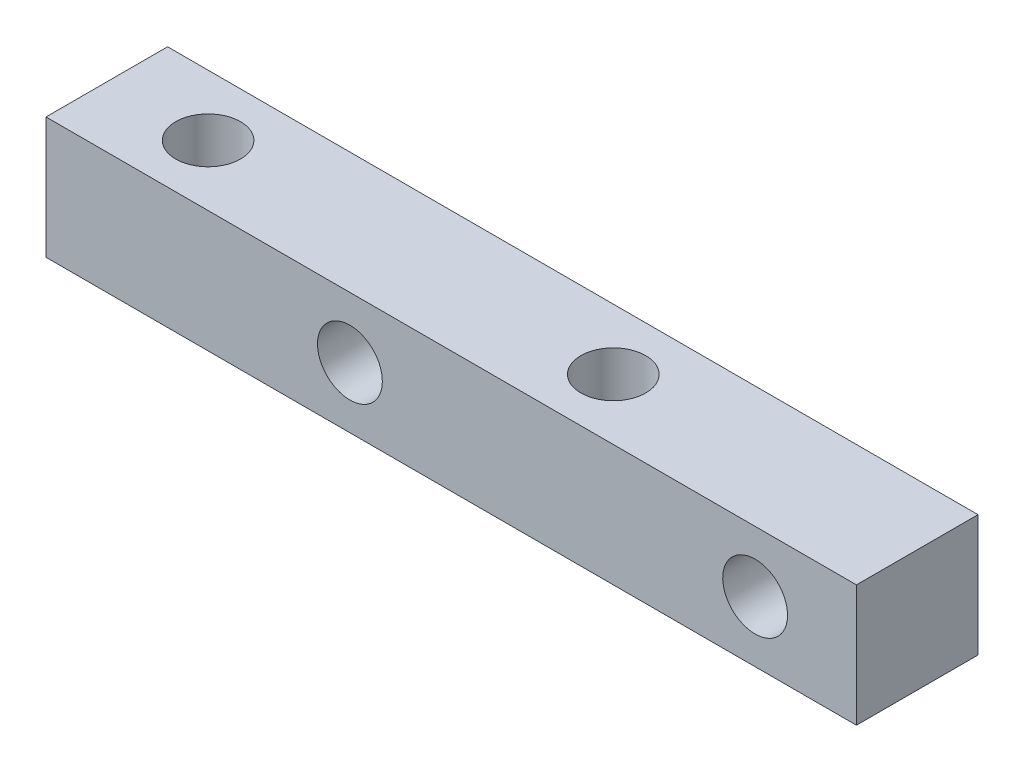
ISO-10303-21;
HEADER;
FILE_DESCRIPTION(('STEP AP214'),'2;1');
FILE_NAME('part.step','',(''),(''),'','','');
FILE_SCHEMA(('AUTOMOTIVE_DESIGN { 1 0 10303 214 1 1 1 1 }'));
ENDSEC;
DATA;
#1=APPLICATION_CONTEXT('core data for automotive mechanical design processes');
#2=APPLICATION_PROTOCOL_DEFINITION('international standard','automotive_design',2000,#1);
#3=PRODUCT_CONTEXT('',#1,'mechanical');
#4=PRODUCT('Part','Part','',(#3));
#5=PRODUCT_RELATED_PRODUCT_CATEGORY('part','',(#4));
#6=PRODUCT_DEFINITION_FORMATION('','',#4);
#7=PRODUCT_DEFINITION_CONTEXT('part definition',#1,'design');
#8=PRODUCT_DEFINITION('design','',#6,#7);
#9=PRODUCT_DEFINITION_SHAPE('','',#8);
#10=(LENGTH_UNIT() NAMED_UNIT(*) SI_UNIT(.MILLI.,.METRE.));
#11=(NAMED_UNIT(*) PLANE_ANGLE_UNIT() SI_UNIT($,.RADIAN.));
#12=(NAMED_UNIT(*) SI_UNIT($,.STERADIAN.) SOLID_ANGLE_UNIT());
#13=UNCERTAINTY_MEASURE_WITH_UNIT(LENGTH_MEASURE(1.E-05),#10,'distance_accuracy_value','');
#14=(GEOMETRIC_REPRESENTATION_CONTEXT(3) GLOBAL_UNCERTAINTY_ASSIGNED_CONTEXT((#13)) GLOBAL_UNIT_ASSIGNED_CONTEXT((#10,
#11,#12)) REPRESENTATION_CONTEXT('',''));
#15=CARTESIAN_POINT('',(0.,0.,0.));
#16=DIRECTION('',(0.,0.,1.));
#17=DIRECTION('',(1.,0.,0.));
#18=AXIS2_PLACEMENT_3D('',#15,#16,#17);
#19=CARTESIAN_POINT('',(40.,3.,-3.));
#20=DIRECTION('',(0.,0.,1.));
#21=DIRECTION('',(0.,-1.,0.));
#22=AXIS2_PLACEMENT_3D('',#19,#20,#21);
#23=PLANE('',#22);
#24=CARTESIAN_POINT('',(35.,0.,-3.));
#25=DIRECTION('',(0.,0.,-1.));
#26=DIRECTION('',(0.,1.,0.));
#27=AXIS2_PLACEMENT_3D('',#24,#25,#26);
#28=CIRCLE('',#27,1.6);
#29=CARTESIAN_POINT('',(35.,1.6,-3.));
#30=VERTEX_POINT('',#29);
#31=EDGE_CURVE('E123',#30,#30,#28,.T.);
#32=ORIENTED_EDGE('',*,*,#31,.F.);
#33=EDGE_LOOP('',(#32));
#34=FACE_BOUND('',#33,.T.);
#35=CARTESIAN_POINT('',(15.,0.,-3.));
#36=DIRECTION('',(0.,0.,-1.));
#37=DIRECTION('',(0.,1.,0.));
#38=AXIS2_PLACEMENT_3D('',#35,#36,#37);
#39=CIRCLE('',#38,1.6);
#40=CARTESIAN_POINT('',(15.,1.6,-3.));
#41=VERTEX_POINT('',#40);
#42=EDGE_CURVE('E119',#41,#41,#39,.T.);
#43=ORIENTED_EDGE('',*,*,#42,.F.);
#44=EDGE_LOOP('',(#43));
#45=FACE_BOUND('',#44,.T.);
#46=DIRECTION('',(0.,1.,0.));
#47=VECTOR('',#46,1.);
#48=CARTESIAN_POINT('',(0.,3.,-3.));
#49=LINE('',#48,#47);
#50=CARTESIAN_POINT('',(0.,-3.,-3.));
#51=VERTEX_POINT('',#50);
#52=CARTESIAN_POINT('',(0.,3.,-3.));
#53=VERTEX_POINT('',#52);
#54=EDGE_CURVE('E102',#51,#53,#49,.T.);
#55=ORIENTED_EDGE('',*,*,#54,.T.);
#56=DIRECTION('',(-1.,0.,0.));
#57=VECTOR('',#56,1.);
#58=CARTESIAN_POINT('',(40.,3.,-3.));
#59=LINE('',#58,#57);
#60=CARTESIAN_POINT('',(40.,3.,-3.));
#61=VERTEX_POINT('',#60);
#62=EDGE_CURVE('E11',#61,#53,#59,.T.);
#63=ORIENTED_EDGE('',*,*,#62,.F.);
#64=DIRECTION('',(0.,1.,0.));
#65=VECTOR('',#64,1.);
#66=CARTESIAN_POINT('',(40.,3.,-3.));
#67=LINE('',#66,#65);
#68=CARTESIAN_POINT('',(40.,-3.,-3.));
#69=VERTEX_POINT('',#68);
#70=EDGE_CURVE('E90',#69,#61,#67,.T.);
#71=ORIENTED_EDGE('',*,*,#70,.F.);
#72=DIRECTION('',(-1.,0.,0.));
#73=VECTOR('',#72,1.);
#74=CARTESIAN_POINT('',(40.,-3.,-3.));
#75=LINE('',#74,#73);
#76=EDGE_CURVE('E98',#69,#51,#75,.T.);
#77=ORIENTED_EDGE('',*,*,#76,.T.);
#78=EDGE_LOOP('',(#55,#63,#71,#77));
#79=FACE_BOUND('',#78,.T.);
#80=ADVANCED_FACE('F39',(#34,#45,#79),#23,.F.);
#81=CARTESIAN_POINT('',(40.,3.,3.));
#82=DIRECTION('',(0.,-1.,0.));
#83=DIRECTION('',(0.,0.,-1.));
#84=AXIS2_PLACEMENT_3D('',#81,#82,#83);
#85=PLANE('',#84);
#86=CARTESIAN_POINT('',(5.,3.,0.));
#87=DIRECTION('',(0.,1.,0.));
#88=DIRECTION('',(0.,0.,1.));
#89=AXIS2_PLACEMENT_3D('',#86,#87,#88);
#90=CIRCLE('',#89,1.6);
#91=CARTESIAN_POINT('',(5.,3.,1.6));
#92=VERTEX_POINT('',#91);
#93=EDGE_CURVE('E134',#92,#92,#90,.T.);
#94=ORIENTED_EDGE('',*,*,#93,.F.);
#95=EDGE_LOOP('',(#94));
#96=FACE_BOUND('',#95,.T.);
#97=CARTESIAN_POINT('',(25.,3.,0.));
#98=DIRECTION('',(0.,1.,0.));
#99=DIRECTION('',(0.,0.,1.));
#100=AXIS2_PLACEMENT_3D('',#97,#98,#99);
#101=CIRCLE('',#100,1.6);
#102=CARTESIAN_POINT('',(25.,3.,1.6));
#103=VERTEX_POINT('',#102);
#104=EDGE_CURVE('E131',#103,#103,#101,.T.);
#105=ORIENTED_EDGE('',*,*,#104,.F.);
#106=EDGE_LOOP('',(#105));
#107=FACE_BOUND('',#106,.T.);
#108=DIRECTION('',(0.,0.,1.));
#109=VECTOR('',#108,1.);
#110=CARTESIAN_POINT('',(0.,3.,3.));
#111=LINE('',#110,#109);
#112=CARTESIAN_POINT('',(0.,3.,3.));
#113=VERTEX_POINT('',#112);
#114=EDGE_CURVE('E94',#53,#113,#111,.T.);
#115=ORIENTED_EDGE('',*,*,#114,.T.);
#116=DIRECTION('',(-1.,0.,0.));
#117=VECTOR('',#116,1.);
#118=CARTESIAN_POINT('',(40.,3.,3.));
#119=LINE('',#118,#117);
#120=CARTESIAN_POINT('',(40.,3.,3.));
#121=VERTEX_POINT('',#120);
#122=EDGE_CURVE('E47',#121,#113,#119,.T.);
#123=ORIENTED_EDGE('',*,*,#122,.F.);
#124=DIRECTION('',(0.,0.,1.));
#125=VECTOR('',#124,1.);
#126=CARTESIAN_POINT('',(40.,3.,3.));
#127=LINE('',#126,#125);
#128=EDGE_CURVE('E85',#61,#121,#127,.T.);
#129=ORIENTED_EDGE('',*,*,#128,.F.);
#130=ORIENTED_EDGE('',*,*,#62,.T.);
#131=EDGE_LOOP('',(#115,#123,#129,#130));
#132=FACE_BOUND('',#131,.T.);
#133=ADVANCED_FACE('F93',(#96,#107,#132),#85,.F.);
#134=CARTESIAN_POINT('',(40.,3.,3.));
#135=DIRECTION('',(0.,0.,-1.));
#136=DIRECTION('',(0.,1.,0.));
#137=AXIS2_PLACEMENT_3D('',#134,#135,#136);
#138=PLANE('',#137);
#139=CARTESIAN_POINT('',(35.,0.,3.));
#140=DIRECTION('',(0.,0.,-1.));
#141=DIRECTION('',(0.,1.,0.));
#142=AXIS2_PLACEMENT_3D('',#139,#140,#141);
#143=CIRCLE('',#142,1.6);
#144=CARTESIAN_POINT('',(35.,1.6,3.));
#145=VERTEX_POINT('',#144);
#146=EDGE_CURVE('E105',#145,#145,#143,.T.);
#147=ORIENTED_EDGE('',*,*,#146,.T.);
#148=EDGE_LOOP('',(#147));
#149=FACE_BOUND('',#148,.T.);
#150=CARTESIAN_POINT('',(15.,0.,3.));
#151=DIRECTION('',(0.,0.,-1.));
#152=DIRECTION('',(0.,1.,0.));
#153=AXIS2_PLACEMENT_3D('',#150,#151,#152);
#154=CIRCLE('',#153,1.6);
#155=CARTESIAN_POINT('',(15.,1.6,3.));
#156=VERTEX_POINT('',#155);
#157=EDGE_CURVE('E116',#156,#156,#154,.T.);
#158=ORIENTED_EDGE('',*,*,#157,.T.);
#159=EDGE_LOOP('',(#158));
#160=FACE_BOUND('',#159,.T.);
#161=DIRECTION('',(0.,-1.,0.));
#162=VECTOR('',#161,1.);
#163=CARTESIAN_POINT('',(0.,3.,3.));
#164=LINE('',#163,#162);
#165=CARTESIAN_POINT('',(0.,-3.,3.));
#166=VERTEX_POINT('',#165);
#167=EDGE_CURVE('E72',#113,#166,#164,.T.);
#168=ORIENTED_EDGE('',*,*,#167,.T.);
#169=DIRECTION('',(-1.,0.,0.));
#170=VECTOR('',#169,1.);
#171=CARTESIAN_POINT('',(40.,-3.,3.));
#172=LINE('',#171,#170);
#173=CARTESIAN_POINT('',(40.,-3.,3.));
#174=VERTEX_POINT('',#173);
#175=EDGE_CURVE('E95',#174,#166,#172,.T.);
#176=ORIENTED_EDGE('',*,*,#175,.F.);
#177=DIRECTION('',(0.,-1.,0.));
#178=VECTOR('',#177,1.);
#179=CARTESIAN_POINT('',(40.,3.,3.));
#180=LINE('',#179,#178);
#181=EDGE_CURVE('E88',#121,#174,#180,.T.);
#182=ORIENTED_EDGE('',*,*,#181,.F.);
#183=ORIENTED_EDGE('',*,*,#122,.T.);
#184=EDGE_LOOP('',(#168,#176,#182,#183));
#185=FACE_BOUND('',#184,.T.);
#186=ADVANCED_FACE('F96',(#149,#160,#185),#138,.F.);
#187=CARTESIAN_POINT('',(40.,-3.,3.));
#188=DIRECTION('',(0.,1.,0.));
#189=DIRECTION('',(0.,0.,1.));
#190=AXIS2_PLACEMENT_3D('',#187,#188,#189);
#191=PLANE('',#190);
#192=CARTESIAN_POINT('',(5.,-3.,0.));
#193=DIRECTION('',(0.,1.,0.));
#194=DIRECTION('',(0.,0.,1.));
#195=AXIS2_PLACEMENT_3D('',#192,#193,#194);
#196=CIRCLE('',#195,1.6);
#197=CARTESIAN_POINT('',(5.,-3.,1.6));
#198=VERTEX_POINT('',#197);
#199=EDGE_CURVE('E120',#198,#198,#196,.T.);
#200=ORIENTED_EDGE('',*,*,#199,.T.);
#201=EDGE_LOOP('',(#200));
#202=FACE_BOUND('',#201,.T.);
#203=CARTESIAN_POINT('',(25.,-3.,0.));
#204=DIRECTION('',(0.,1.,0.));
#205=DIRECTION('',(0.,0.,1.));
#206=AXIS2_PLACEMENT_3D('',#203,#204,#205);
#207=CIRCLE('',#206,1.6);
#208=CARTESIAN_POINT('',(25.,-3.,1.6));
#209=VERTEX_POINT('',#208);
#210=EDGE_CURVE('E128',#209,#209,#207,.T.);
#211=ORIENTED_EDGE('',*,*,#210,.T.);
#212=EDGE_LOOP('',(#211));
#213=FACE_BOUND('',#212,.T.);
#214=DIRECTION('',(0.,0.,-1.));
#215=VECTOR('',#214,1.);
#216=CARTESIAN_POINT('',(0.,-3.,3.));
#217=LINE('',#216,#215);
#218=EDGE_CURVE('E78',#166,#51,#217,.T.);
#219=ORIENTED_EDGE('',*,*,#218,.T.);
#220=ORIENTED_EDGE('',*,*,#76,.F.);
#221=DIRECTION('',(0.,0.,-1.));
#222=VECTOR('',#221,1.);
#223=CARTESIAN_POINT('',(40.,-3.,3.));
#224=LINE('',#223,#222);
#225=EDGE_CURVE('E55',#174,#69,#224,.T.);
#226=ORIENTED_EDGE('',*,*,#225,.F.);
#227=ORIENTED_EDGE('',*,*,#175,.T.);
#228=EDGE_LOOP('',(#219,#220,#226,#227));
#229=FACE_BOUND('',#228,.T.);
#230=ADVANCED_FACE('F110',(#202,#213,#229),#191,.F.);
#231=CARTESIAN_POINT('',(40.,0.,0.));
#232=DIRECTION('',(1.,0.,0.));
#233=DIRECTION('',(0.,0.,-1.));
#234=AXIS2_PLACEMENT_3D('',#231,#232,#233);
#235=PLANE('',#234);
#236=ORIENTED_EDGE('',*,*,#70,.T.);
#237=ORIENTED_EDGE('',*,*,#128,.T.);
#238=ORIENTED_EDGE('',*,*,#181,.T.);
#239=ORIENTED_EDGE('',*,*,#225,.T.);
#240=EDGE_LOOP('',(#236,#237,#238,#239));
#241=FACE_BOUND('',#240,.T.);
#242=ADVANCED_FACE('F86',(#241),#235,.T.);
#243=CARTESIAN_POINT('',(0.,0.,0.));
#244=DIRECTION('',(1.,0.,0.));
#245=DIRECTION('',(0.,0.,-1.));
#246=AXIS2_PLACEMENT_3D('',#243,#244,#245);
#247=PLANE('',#246);
#248=ORIENTED_EDGE('',*,*,#54,.F.);
#249=ORIENTED_EDGE('',*,*,#218,.F.);
#250=ORIENTED_EDGE('',*,*,#167,.F.);
#251=ORIENTED_EDGE('',*,*,#114,.F.);
#252=EDGE_LOOP('',(#248,#249,#250,#251));
#253=FACE_BOUND('',#252,.T.);
#254=ADVANCED_FACE('F113',(#253),#247,.F.);
#255=CARTESIAN_POINT('',(15.,0.,3.));
#256=DIRECTION('',(0.,0.,-1.));
#257=DIRECTION('',(0.,1.,0.));
#258=AXIS2_PLACEMENT_3D('',#255,#256,#257);
#259=CYLINDRICAL_SURFACE('',#258,1.6);
#260=CARTESIAN_POINT('',(15.,1.6,3.));
#261=CARTESIAN_POINT('',(15.,1.6,2.9375));
#262=CARTESIAN_POINT('',(15.,1.6,2.875));
#263=CARTESIAN_POINT('',(15.,1.6,2.75));
#264=CARTESIAN_POINT('',(15.,1.6,2.6875));
#265=CARTESIAN_POINT('',(15.,1.6,2.5625));
#266=CARTESIAN_POINT('',(15.,1.6,2.5));
#267=CARTESIAN_POINT('',(15.,1.6,2.375));
#268=CARTESIAN_POINT('',(15.,1.6,2.3125));
#269=CARTESIAN_POINT('',(15.,1.6,2.1875));
#270=CARTESIAN_POINT('',(15.,1.6,2.125));
#271=CARTESIAN_POINT('',(15.,1.6,2.));
#272=CARTESIAN_POINT('',(15.,1.6,1.9375));
#273=CARTESIAN_POINT('',(15.,1.6,1.8125));
#274=CARTESIAN_POINT('',(15.,1.6,1.75));
#275=CARTESIAN_POINT('',(15.,1.6,1.625));
#276=CARTESIAN_POINT('',(15.,1.6,1.5625));
#277=CARTESIAN_POINT('',(15.,1.6,1.4375));
#278=CARTESIAN_POINT('',(15.,1.6,1.375));
#279=CARTESIAN_POINT('',(15.,1.6,1.25));
#280=CARTESIAN_POINT('',(15.,1.6,1.1875));
#281=CARTESIAN_POINT('',(15.,1.6,1.0625));
#282=CARTESIAN_POINT('',(15.,1.6,1.));
#283=CARTESIAN_POINT('',(15.,1.6,0.875000000000001));
#284=CARTESIAN_POINT('',(15.,1.6,0.812500000000001));
#285=CARTESIAN_POINT('',(15.,1.6,0.687500000000001));
#286=CARTESIAN_POINT('',(15.,1.6,0.625000000000001));
#287=CARTESIAN_POINT('',(15.,1.6,0.500000000000001));
#288=CARTESIAN_POINT('',(15.,1.6,0.437500000000001));
#289=CARTESIAN_POINT('',(15.,1.6,0.312500000000001));
#290=CARTESIAN_POINT('',(15.,1.6,0.250000000000001));
#291=CARTESIAN_POINT('',(15.,1.6,0.125000000000001));
#292=CARTESIAN_POINT('',(15.,1.6,0.0625000000000005));
#293=CARTESIAN_POINT('',(15.,1.6,-0.0624999999999996));
#294=CARTESIAN_POINT('',(15.,1.6,-0.125));
#295=CARTESIAN_POINT('',(15.,1.6,-0.25));
#296=CARTESIAN_POINT('',(15.,1.6,-0.3125));
#297=CARTESIAN_POINT('',(15.,1.6,-0.4375));
#298=CARTESIAN_POINT('',(15.,1.6,-0.5));
#299=CARTESIAN_POINT('',(15.,1.6,-0.625));
#300=CARTESIAN_POINT('',(15.,1.6,-0.6875));
#301=CARTESIAN_POINT('',(15.,1.6,-0.812499999999999));
#302=CARTESIAN_POINT('',(15.,1.6,-0.874999999999999));
#303=CARTESIAN_POINT('',(15.,1.6,-0.999999999999999));
#304=CARTESIAN_POINT('',(15.,1.6,-1.0625));
#305=CARTESIAN_POINT('',(15.,1.6,-1.1875));
#306=CARTESIAN_POINT('',(15.,1.6,-1.25));
#307=CARTESIAN_POINT('',(15.,1.6,-1.375));
#308=CARTESIAN_POINT('',(15.,1.6,-1.4375));
#309=CARTESIAN_POINT('',(15.,1.6,-1.5625));
#310=CARTESIAN_POINT('',(15.,1.6,-1.625));
#311=CARTESIAN_POINT('',(15.,1.6,-1.75));
#312=CARTESIAN_POINT('',(15.,1.6,-1.8125));
#313=CARTESIAN_POINT('',(15.,1.6,-1.9375));
#314=CARTESIAN_POINT('',(15.,1.6,-2.));
#315=CARTESIAN_POINT('',(15.,1.6,-2.125));
#316=CARTESIAN_POINT('',(15.,1.6,-2.1875));
#317=CARTESIAN_POINT('',(15.,1.6,-2.3125));
#318=CARTESIAN_POINT('',(15.,1.6,-2.375));
#319=CARTESIAN_POINT('',(15.,1.6,-2.5));
#320=CARTESIAN_POINT('',(15.,1.6,-2.5625));
#321=CARTESIAN_POINT('',(15.,1.6,-2.6875));
#322=CARTESIAN_POINT('',(15.,1.6,-2.75));
#323=CARTESIAN_POINT('',(15.,1.6,-2.875));
#324=CARTESIAN_POINT('',(15.,1.6,-2.9375));
#325=CARTESIAN_POINT('',(15.,1.6,-3.));
#326=B_SPLINE_CURVE_WITH_KNOTS('',3,(#260,#261,#262,#263,#264,#265,#266,#267,#268,#269,#270,
#271,#272,#273,#274,#275,#276,#277,#278,#279,#280,#281,#282,#283,#284,#285,#286,#287,#288,#289,
#290,#291,#292,#293,#294,#295,#296,#297,#298,#299,#300,#301,#302,#303,#304,#305,#306,#307,#308,
#309,#310,#311,#312,#313,#314,#315,#316,#317,#318,#319,#320,#321,#322,#323,#324,#325),
.UNSPECIFIED.,.F.,.F.,(4,2,2,2,2,2,2,2,2,2,2,2,2,2,2,2,2,2,2,2,2,2,2,2,2,2,2,2,2,2,2,2,4),(0.,
0.1875,0.375,0.5625,0.75,0.9375,1.125,1.3125,1.5,1.6875,1.875,2.0625,2.25,2.4375,2.625,2.8125,
3.,3.1875,3.375,3.5625,3.75,3.9375,4.125,4.3125,4.5,4.6875,4.875,5.0625,5.25,5.4375,5.625,
5.8125,6.),.UNSPECIFIED.);
#327=EDGE_CURVE('BSEAM160',#156,#41,#326,.T.);
#328=ORIENTED_EDGE('',*,*,#157,.F.);
#329=ORIENTED_EDGE('',*,*,#42,.T.);
#330=ORIENTED_EDGE('',*,*,#327,.T.);
#331=ORIENTED_EDGE('',*,*,#327,.F.);
#332=EDGE_LOOP('',(#328,#330,#329,#331));
#333=FACE_BOUND('',#332,.T.);
#334=ADVANCED_FACE('F160',(#333),#259,.F.);
#335=CARTESIAN_POINT('',(35.,0.,3.));
#336=DIRECTION('',(0.,0.,-1.));
#337=DIRECTION('',(0.,1.,0.));
#338=AXIS2_PLACEMENT_3D('',#335,#336,#337);
#339=CYLINDRICAL_SURFACE('',#338,1.6);
#340=CARTESIAN_POINT('',(35.,1.6,3.));
#341=CARTESIAN_POINT('',(35.,1.6,2.9375));
#342=CARTESIAN_POINT('',(35.,1.6,2.875));
#343=CARTESIAN_POINT('',(35.,1.6,2.75));
#344=CARTESIAN_POINT('',(35.,1.6,2.6875));
#345=CARTESIAN_POINT('',(35.,1.6,2.5625));
#346=CARTESIAN_POINT('',(35.,1.6,2.5));
#347=CARTESIAN_POINT('',(35.,1.6,2.375));
#348=CARTESIAN_POINT('',(35.,1.6,2.3125));
#349=CARTESIAN_POINT('',(35.,1.6,2.1875));
#350=CARTESIAN_POINT('',(35.,1.6,2.125));
#351=CARTESIAN_POINT('',(35.,1.6,2.));
#352=CARTESIAN_POINT('',(35.,1.6,1.9375));
#353=CARTESIAN_POINT('',(35.,1.6,1.8125));
#354=CARTESIAN_POINT('',(35.,1.6,1.75));
#355=CARTESIAN_POINT('',(35.,1.6,1.625));
#356=CARTESIAN_POINT('',(35.,1.6,1.5625));
#357=CARTESIAN_POINT('',(35.,1.6,1.4375));
#358=CARTESIAN_POINT('',(35.,1.6,1.375));
#359=CARTESIAN_POINT('',(35.,1.6,1.25));
#360=CARTESIAN_POINT('',(35.,1.6,1.1875));
#361=CARTESIAN_POINT('',(35.,1.6,1.0625));
#362=CARTESIAN_POINT('',(35.,1.6,1.));
#363=CARTESIAN_POINT('',(35.,1.6,0.875000000000001));
#364=CARTESIAN_POINT('',(35.,1.6,0.812500000000001));
#365=CARTESIAN_POINT('',(35.,1.6,0.687500000000001));
#366=CARTESIAN_POINT('',(35.,1.6,0.625000000000001));
#367=CARTESIAN_POINT('',(35.,1.6,0.500000000000001));
#368=CARTESIAN_POINT('',(35.,1.6,0.437500000000001));
#369=CARTESIAN_POINT('',(35.,1.6,0.312500000000001));
#370=CARTESIAN_POINT('',(35.,1.6,0.250000000000001));
#371=CARTESIAN_POINT('',(35.,1.6,0.125000000000001));
#372=CARTESIAN_POINT('',(35.,1.6,0.0625000000000005));
#373=CARTESIAN_POINT('',(35.,1.6,-0.0624999999999996));
#374=CARTESIAN_POINT('',(35.,1.6,-0.125));
#375=CARTESIAN_POINT('',(35.,1.6,-0.25));
#376=CARTESIAN_POINT('',(35.,1.6,-0.3125));
#377=CARTESIAN_POINT('',(35.,1.6,-0.4375));
#378=CARTESIAN_POINT('',(35.,1.6,-0.5));
#379=CARTESIAN_POINT('',(35.,1.6,-0.625));
#380=CARTESIAN_POINT('',(35.,1.6,-0.6875));
#381=CARTESIAN_POINT('',(35.,1.6,-0.812499999999999));
#382=CARTESIAN_POINT('',(35.,1.6,-0.874999999999999));
#383=CARTESIAN_POINT('',(35.,1.6,-0.999999999999999));
#384=CARTESIAN_POINT('',(35.,1.6,-1.0625));
#385=CARTESIAN_POINT('',(35.,1.6,-1.1875));
#386=CARTESIAN_POINT('',(35.,1.6,-1.25));
#387=CARTESIAN_POINT('',(35.,1.6,-1.375));
#388=CARTESIAN_POINT('',(35.,1.6,-1.4375));
#389=CARTESIAN_POINT('',(35.,1.6,-1.5625));
#390=CARTESIAN_POINT('',(35.,1.6,-1.625));
#391=CARTESIAN_POINT('',(35.,1.6,-1.75));
#392=CARTESIAN_POINT('',(35.,1.6,-1.8125));
#393=CARTESIAN_POINT('',(35.,1.6,-1.9375));
#394=CARTESIAN_POINT('',(35.,1.6,-2.));
#395=CARTESIAN_POINT('',(35.,1.6,-2.125));
#396=CARTESIAN_POINT('',(35.,1.6,-2.1875));
#397=CARTESIAN_POINT('',(35.,1.6,-2.3125));
#398=CARTESIAN_POINT('',(35.,1.6,-2.375));
#399=CARTESIAN_POINT('',(35.,1.6,-2.5));
#400=CARTESIAN_POINT('',(35.,1.6,-2.5625));
#401=CARTESIAN_POINT('',(35.,1.6,-2.6875));
#402=CARTESIAN_POINT('',(35.,1.6,-2.75));
#403=CARTESIAN_POINT('',(35.,1.6,-2.875));
#404=CARTESIAN_POINT('',(35.,1.6,-2.9375));
#405=CARTESIAN_POINT('',(35.,1.6,-3.));
#406=B_SPLINE_CURVE_WITH_KNOTS('',3,(#340,#341,#342,#343,#344,#345,#346,#347,#348,#349,#350,
#351,#352,#353,#354,#355,#356,#357,#358,#359,#360,#361,#362,#363,#364,#365,#366,#367,#368,#369,
#370,#371,#372,#373,#374,#375,#376,#377,#378,#379,#380,#381,#382,#383,#384,#385,#386,#387,#388,
#389,#390,#391,#392,#393,#394,#395,#396,#397,#398,#399,#400,#401,#402,#403,#404,#405),
.UNSPECIFIED.,.F.,.F.,(4,2,2,2,2,2,2,2,2,2,2,2,2,2,2,2,2,2,2,2,2,2,2,2,2,2,2,2,2,2,2,2,4),(0.,
0.1875,0.375,0.5625,0.75,0.9375,1.125,1.3125,1.5,1.6875,1.875,2.0625,2.25,2.4375,2.625,2.8125,
3.,3.1875,3.375,3.5625,3.75,3.9375,4.125,4.3125,4.5,4.6875,4.875,5.0625,5.25,5.4375,5.625,
5.8125,6.),.UNSPECIFIED.);
#407=EDGE_CURVE('BSEAM154',#145,#30,#406,.T.);
#408=ORIENTED_EDGE('',*,*,#146,.F.);
#409=ORIENTED_EDGE('',*,*,#31,.T.);
#410=ORIENTED_EDGE('',*,*,#407,.T.);
#411=ORIENTED_EDGE('',*,*,#407,.F.);
#412=EDGE_LOOP('',(#408,#410,#409,#411));
#413=FACE_BOUND('',#412,.T.);
#414=ADVANCED_FACE('F154',(#413),#339,.F.);
#415=CARTESIAN_POINT('',(25.,-3.,0.));
#416=DIRECTION('',(0.,1.,0.));
#417=DIRECTION('',(0.,0.,1.));
#418=AXIS2_PLACEMENT_3D('',#415,#416,#417);
#419=CYLINDRICAL_SURFACE('',#418,1.6);
#420=ORIENTED_EDGE('',*,*,#210,.F.);
#421=EDGE_LOOP('',(#420));
#422=FACE_BOUND('',#421,.T.);
#423=ORIENTED_EDGE('',*,*,#104,.T.);
#424=EDGE_LOOP('',(#423));
#425=FACE_BOUND('',#424,.T.);
#426=ADVANCED_FACE('F145',(#422,#425),#419,.F.);
#427=CARTESIAN_POINT('',(5.,-3.,0.));
#428=DIRECTION('',(0.,1.,0.));
#429=DIRECTION('',(0.,0.,1.));
#430=AXIS2_PLACEMENT_3D('',#427,#428,#429);
#431=CYLINDRICAL_SURFACE('',#430,1.6);
#432=ORIENTED_EDGE('',*,*,#199,.F.);
#433=EDGE_LOOP('',(#432));
#434=FACE_BOUND('',#433,.T.);
#435=ORIENTED_EDGE('',*,*,#93,.T.);
#436=EDGE_LOOP('',(#435));
#437=FACE_BOUND('',#436,.T.);
#438=ADVANCED_FACE('F142',(#434,#437),#431,.F.);
#439=CLOSED_SHELL('',(#80,#133,#186,#230,#242,#254,#334,#414,#426,#438));
#440=MANIFOLD_SOLID_BREP('B2',#439);
#441=ADVANCED_BREP_SHAPE_REPRESENTATION('',(#18,#440),#14);
#442=SHAPE_DEFINITION_REPRESENTATION(#9,#441);
ENDSEC;
END-ISO-10303-21;
